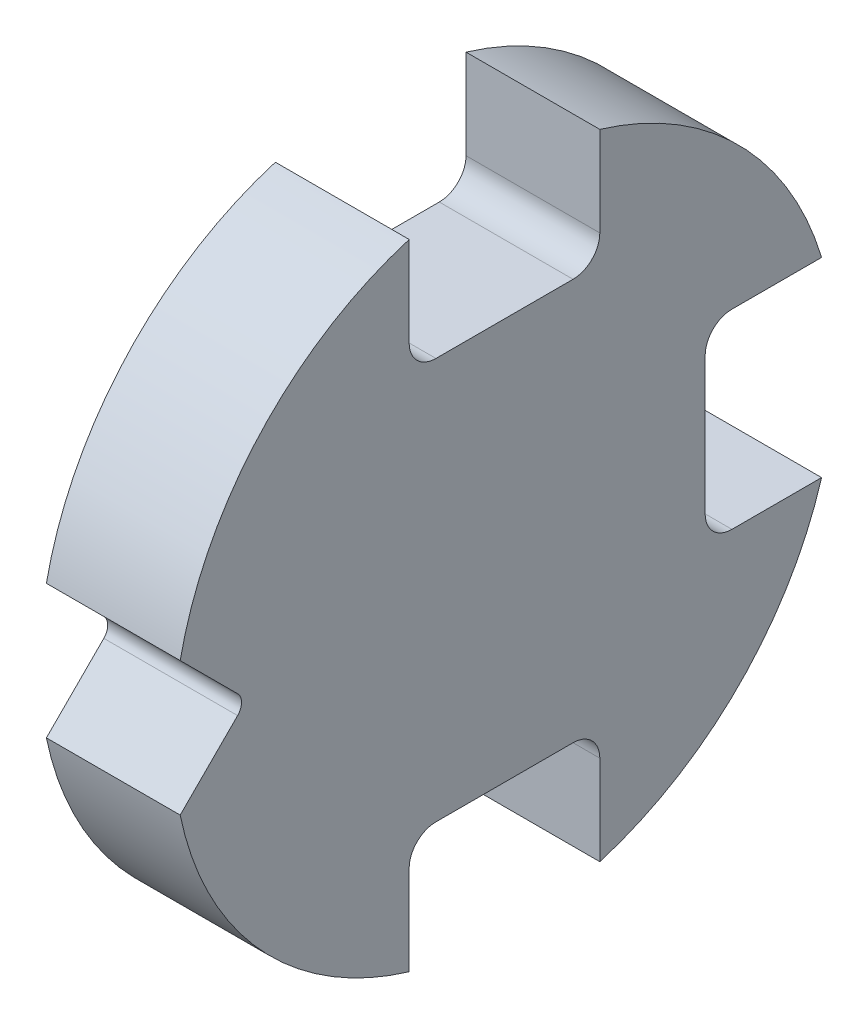
ISO-10303-21;
HEADER;
FILE_DESCRIPTION(('STEP AP214'),'2;1');
FILE_NAME('part.step','',(''),(''),'','','');
FILE_SCHEMA(('AUTOMOTIVE_DESIGN { 1 0 10303 214 1 1 1 1 }'));
ENDSEC;
DATA;
#1=APPLICATION_CONTEXT('core data for automotive mechanical design processes');
#2=APPLICATION_PROTOCOL_DEFINITION('international standard','automotive_design',2000,#1);
#3=PRODUCT_CONTEXT('',#1,'mechanical');
#4=PRODUCT('Part','Part','',(#3));
#5=PRODUCT_RELATED_PRODUCT_CATEGORY('part','',(#4));
#6=PRODUCT_DEFINITION_FORMATION('','',#4);
#7=PRODUCT_DEFINITION_CONTEXT('part definition',#1,'design');
#8=PRODUCT_DEFINITION('design','',#6,#7);
#9=PRODUCT_DEFINITION_SHAPE('','',#8);
#10=(LENGTH_UNIT() NAMED_UNIT(*) SI_UNIT(.MILLI.,.METRE.));
#11=(NAMED_UNIT(*) PLANE_ANGLE_UNIT() SI_UNIT($,.RADIAN.));
#12=(NAMED_UNIT(*) SI_UNIT($,.STERADIAN.) SOLID_ANGLE_UNIT());
#13=UNCERTAINTY_MEASURE_WITH_UNIT(LENGTH_MEASURE(1.E-05),#10,'distance_accuracy_value','');
#14=(GEOMETRIC_REPRESENTATION_CONTEXT(3) GLOBAL_UNCERTAINTY_ASSIGNED_CONTEXT((#13)) GLOBAL_UNIT_ASSIGNED_CONTEXT((#10,
#11,#12)) REPRESENTATION_CONTEXT('',''));
#15=CARTESIAN_POINT('',(0.,0.,0.));
#16=DIRECTION('',(0.,0.,1.));
#17=DIRECTION('',(1.,0.,0.));
#18=AXIS2_PLACEMENT_3D('',#15,#16,#17);
#19=CARTESIAN_POINT('',(44.13,0.,4.13078041851604));
#20=DIRECTION('',(1.,0.,0.));
#21=DIRECTION('',(0.,0.,-1.));
#22=AXIS2_PLACEMENT_3D('',#19,#20,#21);
#23=CYLINDRICAL_SURFACE('',#22,0.2);
#24=DIRECTION('',(1.,0.,0.));
#25=VECTOR('',#24,1.);
#26=CARTESIAN_POINT('',(45.13,0.14142135623743,3.98935906213743));
#27=LINE('',#26,#25);
#28=CARTESIAN_POINT('',(44.13,0.141421356231545,3.98935906220226));
#29=VERTEX_POINT('',#28);
#30=CARTESIAN_POINT('',(46.13,0.141421356272725,3.98935906217272));
#31=VERTEX_POINT('',#30);
#32=EDGE_CURVE('E176',#29,#31,#27,.T.);
#33=ORIENTED_EDGE('',*,*,#32,.F.);
#34=CARTESIAN_POINT('',(44.13,0.,4.13078041851604));
#35=DIRECTION('',(1.,0.,0.));
#36=DIRECTION('',(0.,0.,-1.));
#37=AXIS2_PLACEMENT_3D('',#34,#35,#36);
#38=CIRCLE('',#37,0.2);
#39=CARTESIAN_POINT('',(44.13,-0.141421356272665,3.98935906217266));
#40=VERTEX_POINT('',#39);
#41=EDGE_CURVE('E20',#40,#29,#38,.T.);
#42=ORIENTED_EDGE('',*,*,#41,.F.);
#43=DIRECTION('',(1.,0.,0.));
#44=VECTOR('',#43,1.);
#45=CARTESIAN_POINT('',(45.13,-0.141421356237311,3.98935906213731));
#46=LINE('',#45,#44);
#47=CARTESIAN_POINT('',(46.13,-0.141421356272666,3.98935906217266));
#48=VERTEX_POINT('',#47);
#49=EDGE_CURVE('E226',#48,#40,#46,.F.);
#50=ORIENTED_EDGE('',*,*,#49,.F.);
#51=CARTESIAN_POINT('',(46.13,0.,4.13078041851604));
#52=DIRECTION('',(1.,0.,0.));
#53=DIRECTION('',(0.,0.,-1.));
#54=AXIS2_PLACEMENT_3D('',#51,#52,#53);
#55=CIRCLE('',#54,0.2);
#56=EDGE_CURVE('E175',#31,#48,#55,.F.);
#57=ORIENTED_EDGE('',*,*,#56,.F.);
#58=EDGE_LOOP('',(#33,#42,#50,#57));
#59=FACE_BOUND('',#58,.T.);
#60=ADVANCED_FACE('F17',(#59),#23,.F.);
#61=CARTESIAN_POINT('',(45.13,-0.500000000009512,4.34793770590951));
#62=DIRECTION('',(0.,0.707106781186548,0.707106781186547));
#63=DIRECTION('',(0.,-0.707106781186547,0.707106781186548));
#64=AXIS2_PLACEMENT_3D('',#61,#62,#63);
#65=PLANE('',#64);
#66=DIRECTION('',(1.,0.,0.));
#67=VECTOR('',#66,1.);
#68=CARTESIAN_POINT('',(45.13,-1.00000000000862,4.84793770586863));
#69=LINE('',#68,#67);
#70=CARTESIAN_POINT('',(46.13,-0.999999999992045,4.84793770587205));
#71=VERTEX_POINT('',#70);
#72=CARTESIAN_POINT('',(44.13,-0.999999999992044,4.84793770587205));
#73=VERTEX_POINT('',#72);
#74=EDGE_CURVE('E273',#71,#73,#69,.F.);
#75=ORIENTED_EDGE('',*,*,#74,.F.);
#76=DIRECTION('',(0.,-0.707106781186547,0.707106781186548));
#77=VECTOR('',#76,1.);
#78=CARTESIAN_POINT('',(46.13,-0.500000000009512,4.34793770590951));
#79=LINE('',#78,#77);
#80=EDGE_CURVE('E223',#71,#48,#79,.F.);
#81=ORIENTED_EDGE('',*,*,#80,.T.);
#82=ORIENTED_EDGE('',*,*,#49,.T.);
#83=DIRECTION('',(0.,0.707106781186547,-0.707106781186548));
#84=VECTOR('',#83,1.);
#85=CARTESIAN_POINT('',(44.13,-1.00000000001902,4.84793770591902));
#86=LINE('',#85,#84);
#87=EDGE_CURVE('E174',#73,#40,#86,.T.);
#88=ORIENTED_EDGE('',*,*,#87,.F.);
#89=EDGE_LOOP('',(#75,#81,#82,#88));
#90=FACE_BOUND('',#89,.T.);
#91=ADVANCED_FACE('F305',(#90),#65,.T.);
#92=CARTESIAN_POINT('',(44.13,-8.4,1.425));
#93=DIRECTION('',(0.,0.,1.));
#94=DIRECTION('',(1.,0.,0.));
#95=AXIS2_PLACEMENT_3D('',#92,#93,#94);
#96=PLANE('',#95);
#97=DIRECTION('',(0.,1.,0.));
#98=VECTOR('',#97,1.);
#99=CARTESIAN_POINT('',(44.13,0.,1.425));
#100=LINE('',#99,#98);
#101=CARTESIAN_POINT('',(44.13,-3.40000000005,1.42499999995));
#102=VERTEX_POINT('',#101);
#103=CARTESIAN_POINT('',(44.13,-4.74045092791815,1.425));
#104=VERTEX_POINT('',#103);
#105=EDGE_CURVE('E277',#102,#104,#100,.F.);
#106=ORIENTED_EDGE('',*,*,#105,.F.);
#107=DIRECTION('',(1.,0.,0.));
#108=VECTOR('',#107,1.);
#109=CARTESIAN_POINT('',(44.13,-3.4,1.4249999999));
#110=LINE('',#109,#108);
#111=CARTESIAN_POINT('',(46.13,-3.40000000005,1.42499999995));
#112=VERTEX_POINT('',#111);
#113=EDGE_CURVE('E227',#102,#112,#110,.T.);
#114=ORIENTED_EDGE('',*,*,#113,.T.);
#115=DIRECTION('',(0.,1.,0.));
#116=VECTOR('',#115,1.);
#117=CARTESIAN_POINT('',(46.13,-8.4,1.425));
#118=LINE('',#117,#116);
#119=CARTESIAN_POINT('',(46.13,-4.74045092791815,1.425));
#120=VERTEX_POINT('',#119);
#121=EDGE_CURVE('E220',#120,#112,#118,.T.);
#122=ORIENTED_EDGE('',*,*,#121,.F.);
#123=DIRECTION('',(1.,0.,0.));
#124=VECTOR('',#123,1.);
#125=CARTESIAN_POINT('',(45.13,-4.74045092791815,1.425));
#126=LINE('',#125,#124);
#127=EDGE_CURVE('E272',#104,#120,#126,.T.);
#128=ORIENTED_EDGE('',*,*,#127,.F.);
#129=EDGE_LOOP('',(#106,#114,#122,#128));
#130=FACE_BOUND('',#129,.T.);
#131=ADVANCED_FACE('F318',(#130),#96,.F.);
#132=CARTESIAN_POINT('',(44.13,-3.4000000001,-1.0249999999));
#133=DIRECTION('',(1.,0.,0.));
#134=DIRECTION('',(0.,0.,-1.));
#135=AXIS2_PLACEMENT_3D('',#132,#133,#134);
#136=CYLINDRICAL_SURFACE('',#135,0.4);
#137=DIRECTION('',(1.,0.,0.));
#138=VECTOR('',#137,1.);
#139=CARTESIAN_POINT('',(44.13,-3.,-1.025));
#140=LINE('',#139,#138);
#141=CARTESIAN_POINT('',(46.13,-3.00000000005,-1.02499999995));
#142=VERTEX_POINT('',#141);
#143=CARTESIAN_POINT('',(44.13,-3.,-1.02499999995));
#144=VERTEX_POINT('',#143);
#145=EDGE_CURVE('E219',#142,#144,#140,.F.);
#146=ORIENTED_EDGE('',*,*,#145,.T.);
#147=CARTESIAN_POINT('',(44.13,-3.4000000001,-1.0249999999));
#148=DIRECTION('',(1.,0.,0.));
#149=DIRECTION('',(0.,0.,-1.));
#150=AXIS2_PLACEMENT_3D('',#147,#148,#149);
#151=CIRCLE('',#150,0.4);
#152=CARTESIAN_POINT('',(44.13,-3.40000000005009,-1.425));
#153=VERTEX_POINT('',#152);
#154=EDGE_CURVE('E278',#153,#144,#151,.T.);
#155=ORIENTED_EDGE('',*,*,#154,.F.);
#156=DIRECTION('',(-1.,0.,0.));
#157=VECTOR('',#156,1.);
#158=CARTESIAN_POINT('',(44.13,-3.40000000000017,-1.425));
#159=LINE('',#158,#157);
#160=CARTESIAN_POINT('',(46.13,-3.40000000005009,-1.425));
#161=VERTEX_POINT('',#160);
#162=EDGE_CURVE('E214',#153,#161,#159,.F.);
#163=ORIENTED_EDGE('',*,*,#162,.T.);
#164=CARTESIAN_POINT('',(46.13,-3.4000000001,-1.0249999999));
#165=DIRECTION('',(1.,0.,0.));
#166=DIRECTION('',(0.,0.,-1.));
#167=AXIS2_PLACEMENT_3D('',#164,#165,#166);
#168=CIRCLE('',#167,0.4);
#169=EDGE_CURVE('E222',#142,#161,#168,.F.);
#170=ORIENTED_EDGE('',*,*,#169,.F.);
#171=EDGE_LOOP('',(#146,#155,#163,#170));
#172=FACE_BOUND('',#171,.T.);
#173=ADVANCED_FACE('F394',(#172),#136,.F.);
#174=CARTESIAN_POINT('',(44.13,-3.4000000001,1.0249999999));
#175=DIRECTION('',(1.,0.,0.));
#176=DIRECTION('',(0.,0.,-1.));
#177=AXIS2_PLACEMENT_3D('',#174,#175,#176);
#178=CYLINDRICAL_SURFACE('',#177,0.4);
#179=ORIENTED_EDGE('',*,*,#113,.F.);
#180=CARTESIAN_POINT('',(44.13,-3.4000000001,1.0249999999));
#181=DIRECTION('',(1.,0.,0.));
#182=DIRECTION('',(0.,0.,-1.));
#183=AXIS2_PLACEMENT_3D('',#180,#181,#182);
#184=CIRCLE('',#183,0.4);
#185=CARTESIAN_POINT('',(44.13,-3.,1.02499999994991));
#186=VERTEX_POINT('',#185);
#187=EDGE_CURVE('E274',#186,#102,#184,.T.);
#188=ORIENTED_EDGE('',*,*,#187,.F.);
#189=DIRECTION('',(1.,0.,0.));
#190=VECTOR('',#189,1.);
#191=CARTESIAN_POINT('',(44.13,-3.,1.02499999999983));
#192=LINE('',#191,#190);
#193=CARTESIAN_POINT('',(46.13,-3.00000000005,1.02499999994991));
#194=VERTEX_POINT('',#193);
#195=EDGE_CURVE('E218',#186,#194,#192,.T.);
#196=ORIENTED_EDGE('',*,*,#195,.T.);
#197=CARTESIAN_POINT('',(46.13,-3.4000000001,1.0249999999));
#198=DIRECTION('',(1.,0.,0.));
#199=DIRECTION('',(0.,0.,-1.));
#200=AXIS2_PLACEMENT_3D('',#197,#198,#199);
#201=CIRCLE('',#200,0.4);
#202=EDGE_CURVE('E230',#112,#194,#201,.F.);
#203=ORIENTED_EDGE('',*,*,#202,.F.);
#204=EDGE_LOOP('',(#179,#188,#196,#203));
#205=FACE_BOUND('',#204,.T.);
#206=ADVANCED_FACE('F320',(#205),#178,.F.);
#207=CARTESIAN_POINT('',(44.13,-8.40000000000008,-1.425));
#208=DIRECTION('',(0.,0.,-1.));
#209=DIRECTION('',(-1.,0.,0.));
#210=AXIS2_PLACEMENT_3D('',#207,#208,#209);
#211=PLANE('',#210);
#212=DIRECTION('',(0.,1.,0.));
#213=VECTOR('',#212,1.);
#214=CARTESIAN_POINT('',(46.13,-8.40000000000008,-1.425));
#215=LINE('',#214,#213);
#216=CARTESIAN_POINT('',(46.13,-4.74045092791815,-1.425));
#217=VERTEX_POINT('',#216);
#218=EDGE_CURVE('E212',#161,#217,#215,.F.);
#219=ORIENTED_EDGE('',*,*,#218,.F.);
#220=ORIENTED_EDGE('',*,*,#162,.F.);
#221=DIRECTION('',(0.,1.,0.));
#222=VECTOR('',#221,1.);
#223=CARTESIAN_POINT('',(44.13,0.,-1.425));
#224=LINE('',#223,#222);
#225=CARTESIAN_POINT('',(44.13,-4.74045092791815,-1.425));
#226=VERTEX_POINT('',#225);
#227=EDGE_CURVE('E281',#226,#153,#224,.T.);
#228=ORIENTED_EDGE('',*,*,#227,.F.);
#229=DIRECTION('',(1.,0.,0.));
#230=VECTOR('',#229,1.);
#231=CARTESIAN_POINT('',(45.13,-4.74045092791815,-1.425));
#232=LINE('',#231,#230);
#233=EDGE_CURVE('E268',#217,#226,#232,.F.);
#234=ORIENTED_EDGE('',*,*,#233,.F.);
#235=EDGE_LOOP('',(#219,#220,#228,#234));
#236=FACE_BOUND('',#235,.T.);
#237=ADVANCED_FACE('F391',(#236),#211,.F.);
#238=CARTESIAN_POINT('',(44.13,-1.425,-8.4));
#239=DIRECTION('',(0.,-1.,0.));
#240=DIRECTION('',(0.,0.,-1.));
#241=AXIS2_PLACEMENT_3D('',#238,#239,#240);
#242=PLANE('',#241);
#243=DIRECTION('',(0.,0.,1.));
#244=VECTOR('',#243,1.);
#245=CARTESIAN_POINT('',(44.13,-1.425,2.475));
#246=LINE('',#245,#244);
#247=CARTESIAN_POINT('',(44.13,-1.42499999995,-3.40000000005));
#248=VERTEX_POINT('',#247);
#249=CARTESIAN_POINT('',(44.13,-1.425,-4.74045092791815));
#250=VERTEX_POINT('',#249);
#251=EDGE_CURVE('E285',#248,#250,#246,.F.);
#252=ORIENTED_EDGE('',*,*,#251,.F.);
#253=DIRECTION('',(1.,0.,0.));
#254=VECTOR('',#253,1.);
#255=CARTESIAN_POINT('',(44.13,-1.4249999999,-3.4));
#256=LINE('',#255,#254);
#257=CARTESIAN_POINT('',(46.13,-1.42499999995,-3.40000000005));
#258=VERTEX_POINT('',#257);
#259=EDGE_CURVE('E233',#248,#258,#256,.T.);
#260=ORIENTED_EDGE('',*,*,#259,.T.);
#261=DIRECTION('',(0.,0.,-1.));
#262=VECTOR('',#261,1.);
#263=CARTESIAN_POINT('',(46.13,-1.425,-8.4));
#264=LINE('',#263,#262);
#265=CARTESIAN_POINT('',(46.13,-1.425,-4.74045092791815));
#266=VERTEX_POINT('',#265);
#267=EDGE_CURVE('E209',#266,#258,#264,.F.);
#268=ORIENTED_EDGE('',*,*,#267,.F.);
#269=DIRECTION('',(1.,0.,0.));
#270=VECTOR('',#269,1.);
#271=CARTESIAN_POINT('',(45.13,-1.425,-4.74045092791815));
#272=LINE('',#271,#270);
#273=EDGE_CURVE('E267',#250,#266,#272,.T.);
#274=ORIENTED_EDGE('',*,*,#273,.F.);
#275=EDGE_LOOP('',(#252,#260,#268,#274));
#276=FACE_BOUND('',#275,.T.);
#277=ADVANCED_FACE('F384',(#276),#242,.F.);
#278=CARTESIAN_POINT('',(44.13,1.0249999999,-3.4000000001));
#279=DIRECTION('',(1.,0.,0.));
#280=DIRECTION('',(0.,0.,-1.));
#281=AXIS2_PLACEMENT_3D('',#278,#279,#280);
#282=CYLINDRICAL_SURFACE('',#281,0.4);
#283=DIRECTION('',(1.,0.,0.));
#284=VECTOR('',#283,1.);
#285=CARTESIAN_POINT('',(44.13,1.025,-3.));
#286=LINE('',#285,#284);
#287=CARTESIAN_POINT('',(46.13,1.02499999995,-3.00000000005));
#288=VERTEX_POINT('',#287);
#289=CARTESIAN_POINT('',(44.13,1.02499999995,-3.));
#290=VERTEX_POINT('',#289);
#291=EDGE_CURVE('E208',#288,#290,#286,.F.);
#292=ORIENTED_EDGE('',*,*,#291,.T.);
#293=CARTESIAN_POINT('',(44.13,1.0249999999,-3.4000000001));
#294=DIRECTION('',(1.,0.,0.));
#295=DIRECTION('',(0.,0.,-1.));
#296=AXIS2_PLACEMENT_3D('',#293,#294,#295);
#297=CIRCLE('',#296,0.4);
#298=CARTESIAN_POINT('',(44.13,1.425,-3.40000000005009));
#299=VERTEX_POINT('',#298);
#300=EDGE_CURVE('E286',#299,#290,#297,.T.);
#301=ORIENTED_EDGE('',*,*,#300,.F.);
#302=DIRECTION('',(1.,0.,0.));
#303=VECTOR('',#302,1.);
#304=CARTESIAN_POINT('',(44.13,1.425,-3.40000000000017));
#305=LINE('',#304,#303);
#306=CARTESIAN_POINT('',(46.13,1.425,-3.40000000005009));
#307=VERTEX_POINT('',#306);
#308=EDGE_CURVE('E203',#299,#307,#305,.T.);
#309=ORIENTED_EDGE('',*,*,#308,.T.);
#310=CARTESIAN_POINT('',(46.13,1.0249999999,-3.4000000001));
#311=DIRECTION('',(1.,0.,0.));
#312=DIRECTION('',(0.,0.,-1.));
#313=AXIS2_PLACEMENT_3D('',#310,#311,#312);
#314=CIRCLE('',#313,0.4);
#315=EDGE_CURVE('E211',#288,#307,#314,.F.);
#316=ORIENTED_EDGE('',*,*,#315,.F.);
#317=EDGE_LOOP('',(#292,#301,#309,#316));
#318=FACE_BOUND('',#317,.T.);
#319=ADVANCED_FACE('F395',(#318),#282,.F.);
#320=CARTESIAN_POINT('',(44.13,-1.0249999999,-3.4000000001));
#321=DIRECTION('',(1.,0.,0.));
#322=DIRECTION('',(0.,0.,-1.));
#323=AXIS2_PLACEMENT_3D('',#320,#321,#322);
#324=CYLINDRICAL_SURFACE('',#323,0.4);
#325=ORIENTED_EDGE('',*,*,#259,.F.);
#326=CARTESIAN_POINT('',(44.13,-1.0249999999,-3.4000000001));
#327=DIRECTION('',(1.,0.,0.));
#328=DIRECTION('',(0.,0.,-1.));
#329=AXIS2_PLACEMENT_3D('',#326,#327,#328);
#330=CIRCLE('',#329,0.4);
#331=CARTESIAN_POINT('',(44.13,-1.02499999994991,-3.));
#332=VERTEX_POINT('',#331);
#333=EDGE_CURVE('E282',#332,#248,#330,.T.);
#334=ORIENTED_EDGE('',*,*,#333,.F.);
#335=DIRECTION('',(1.,0.,0.));
#336=VECTOR('',#335,1.);
#337=CARTESIAN_POINT('',(44.13,-1.02499999999983,-3.));
#338=LINE('',#337,#336);
#339=CARTESIAN_POINT('',(46.13,-1.02499999994991,-3.00000000005));
#340=VERTEX_POINT('',#339);
#341=EDGE_CURVE('E207',#332,#340,#338,.T.);
#342=ORIENTED_EDGE('',*,*,#341,.T.);
#343=CARTESIAN_POINT('',(46.13,-1.0249999999,-3.4000000001));
#344=DIRECTION('',(1.,0.,0.));
#345=DIRECTION('',(0.,0.,-1.));
#346=AXIS2_PLACEMENT_3D('',#343,#344,#345);
#347=CIRCLE('',#346,0.4);
#348=EDGE_CURVE('E236',#258,#340,#347,.F.);
#349=ORIENTED_EDGE('',*,*,#348,.F.);
#350=EDGE_LOOP('',(#325,#334,#342,#349));
#351=FACE_BOUND('',#350,.T.);
#352=ADVANCED_FACE('F379',(#351),#324,.F.);
#353=CARTESIAN_POINT('',(44.13,1.425,-8.40000000000008));
#354=DIRECTION('',(0.,1.,0.));
#355=DIRECTION('',(0.,0.,1.));
#356=AXIS2_PLACEMENT_3D('',#353,#354,#355);
#357=PLANE('',#356);
#358=DIRECTION('',(0.,0.,1.));
#359=VECTOR('',#358,1.);
#360=CARTESIAN_POINT('',(46.13,1.425,-8.40000000000008));
#361=LINE('',#360,#359);
#362=CARTESIAN_POINT('',(46.13,1.425,-4.74045092791815));
#363=VERTEX_POINT('',#362);
#364=EDGE_CURVE('E201',#307,#363,#361,.F.);
#365=ORIENTED_EDGE('',*,*,#364,.F.);
#366=ORIENTED_EDGE('',*,*,#308,.F.);
#367=DIRECTION('',(0.,0.,1.));
#368=VECTOR('',#367,1.);
#369=CARTESIAN_POINT('',(44.13,1.425,2.475));
#370=LINE('',#369,#368);
#371=CARTESIAN_POINT('',(44.13,1.425,-4.74045092791815));
#372=VERTEX_POINT('',#371);
#373=EDGE_CURVE('E289',#372,#299,#370,.T.);
#374=ORIENTED_EDGE('',*,*,#373,.F.);
#375=DIRECTION('',(1.,0.,0.));
#376=VECTOR('',#375,1.);
#377=CARTESIAN_POINT('',(45.13,1.425,-4.74045092791815));
#378=LINE('',#377,#376);
#379=EDGE_CURVE('E263',#363,#372,#378,.F.);
#380=ORIENTED_EDGE('',*,*,#379,.F.);
#381=EDGE_LOOP('',(#365,#366,#374,#380));
#382=FACE_BOUND('',#381,.T.);
#383=ADVANCED_FACE('F367',(#382),#357,.F.);
#384=CARTESIAN_POINT('',(44.13,8.4,-1.425));
#385=DIRECTION('',(0.,0.,-1.));
#386=DIRECTION('',(-1.,0.,0.));
#387=AXIS2_PLACEMENT_3D('',#384,#385,#386);
#388=PLANE('',#387);
#389=DIRECTION('',(0.,1.,0.));
#390=VECTOR('',#389,1.);
#391=CARTESIAN_POINT('',(44.13,0.,-1.425));
#392=LINE('',#391,#390);
#393=CARTESIAN_POINT('',(44.13,3.4000000001,-1.42499999995));
#394=VERTEX_POINT('',#393);
#395=CARTESIAN_POINT('',(44.13,4.74045092791815,-1.425));
#396=VERTEX_POINT('',#395);
#397=EDGE_CURVE('E293',#394,#396,#392,.T.);
#398=ORIENTED_EDGE('',*,*,#397,.F.);
#399=DIRECTION('',(1.,0.,0.));
#400=VECTOR('',#399,1.);
#401=CARTESIAN_POINT('',(44.13,3.4000000001,-1.4249999999));
#402=LINE('',#401,#400);
#403=CARTESIAN_POINT('',(46.13,3.4000000001,-1.42499999995));
#404=VERTEX_POINT('',#403);
#405=EDGE_CURVE('E239',#394,#404,#402,.T.);
#406=ORIENTED_EDGE('',*,*,#405,.T.);
#407=DIRECTION('',(0.,1.,0.));
#408=VECTOR('',#407,1.);
#409=CARTESIAN_POINT('',(46.13,8.4,-1.425));
#410=LINE('',#409,#408);
#411=CARTESIAN_POINT('',(46.13,4.74045092791815,-1.425));
#412=VERTEX_POINT('',#411);
#413=EDGE_CURVE('E198',#412,#404,#410,.F.);
#414=ORIENTED_EDGE('',*,*,#413,.F.);
#415=DIRECTION('',(1.,0.,0.));
#416=VECTOR('',#415,1.);
#417=CARTESIAN_POINT('',(45.13,4.74045092791815,-1.425));
#418=LINE('',#417,#416);
#419=EDGE_CURVE('E262',#396,#412,#418,.T.);
#420=ORIENTED_EDGE('',*,*,#419,.F.);
#421=EDGE_LOOP('',(#398,#406,#414,#420));
#422=FACE_BOUND('',#421,.T.);
#423=ADVANCED_FACE('F360',(#422),#388,.F.);
#424=CARTESIAN_POINT('',(44.13,3.4000000001,1.0249999999));
#425=DIRECTION('',(1.,0.,0.));
#426=DIRECTION('',(0.,0.,-1.));
#427=AXIS2_PLACEMENT_3D('',#424,#425,#426);
#428=CYLINDRICAL_SURFACE('',#427,0.4);
#429=DIRECTION('',(1.,0.,0.));
#430=VECTOR('',#429,1.);
#431=CARTESIAN_POINT('',(44.13,3.,1.025));
#432=LINE('',#431,#430);
#433=CARTESIAN_POINT('',(46.13,3.00000000005,1.02499999995));
#434=VERTEX_POINT('',#433);
#435=CARTESIAN_POINT('',(44.13,3.,1.02499999995));
#436=VERTEX_POINT('',#435);
#437=EDGE_CURVE('E197',#434,#436,#432,.F.);
#438=ORIENTED_EDGE('',*,*,#437,.T.);
#439=CARTESIAN_POINT('',(44.13,3.4000000001,1.0249999999));
#440=DIRECTION('',(1.,0.,0.));
#441=DIRECTION('',(0.,0.,-1.));
#442=AXIS2_PLACEMENT_3D('',#439,#440,#441);
#443=CIRCLE('',#442,0.4);
#444=CARTESIAN_POINT('',(44.13,3.40000000005009,1.425));
#445=VERTEX_POINT('',#444);
#446=EDGE_CURVE('E184',#445,#436,#443,.T.);
#447=ORIENTED_EDGE('',*,*,#446,.F.);
#448=DIRECTION('',(1.,0.,0.));
#449=VECTOR('',#448,1.);
#450=CARTESIAN_POINT('',(44.13,3.40000000000017,1.425));
#451=LINE('',#450,#449);
#452=CARTESIAN_POINT('',(46.13,3.40000000005009,1.425));
#453=VERTEX_POINT('',#452);
#454=EDGE_CURVE('E191',#445,#453,#451,.T.);
#455=ORIENTED_EDGE('',*,*,#454,.T.);
#456=CARTESIAN_POINT('',(46.13,3.4000000001,1.0249999999));
#457=DIRECTION('',(1.,0.,0.));
#458=DIRECTION('',(0.,0.,-1.));
#459=AXIS2_PLACEMENT_3D('',#456,#457,#458);
#460=CIRCLE('',#459,0.4);
#461=EDGE_CURVE('E200',#434,#453,#460,.F.);
#462=ORIENTED_EDGE('',*,*,#461,.F.);
#463=EDGE_LOOP('',(#438,#447,#455,#462));
#464=FACE_BOUND('',#463,.T.);
#465=ADVANCED_FACE('F439',(#464),#428,.F.);
#466=CARTESIAN_POINT('',(44.13,3.4000000001,-1.0249999999));
#467=DIRECTION('',(1.,0.,0.));
#468=DIRECTION('',(0.,0.,-1.));
#469=AXIS2_PLACEMENT_3D('',#466,#467,#468);
#470=CYLINDRICAL_SURFACE('',#469,0.4);
#471=ORIENTED_EDGE('',*,*,#405,.F.);
#472=CARTESIAN_POINT('',(44.13,3.4000000001,-1.0249999999));
#473=DIRECTION('',(1.,0.,0.));
#474=DIRECTION('',(0.,0.,-1.));
#475=AXIS2_PLACEMENT_3D('',#472,#473,#474);
#476=CIRCLE('',#475,0.4);
#477=CARTESIAN_POINT('',(44.13,3.,-1.02499999994991));
#478=VERTEX_POINT('',#477);
#479=EDGE_CURVE('E290',#478,#394,#476,.T.);
#480=ORIENTED_EDGE('',*,*,#479,.F.);
#481=DIRECTION('',(1.,0.,0.));
#482=VECTOR('',#481,1.);
#483=CARTESIAN_POINT('',(44.13,3.,-1.02499999999983));
#484=LINE('',#483,#482);
#485=CARTESIAN_POINT('',(46.13,3.00000000005,-1.02499999994991));
#486=VERTEX_POINT('',#485);
#487=EDGE_CURVE('E196',#478,#486,#484,.T.);
#488=ORIENTED_EDGE('',*,*,#487,.T.);
#489=CARTESIAN_POINT('',(46.13,3.4000000001,-1.0249999999));
#490=DIRECTION('',(1.,0.,0.));
#491=DIRECTION('',(0.,0.,-1.));
#492=AXIS2_PLACEMENT_3D('',#489,#490,#491);
#493=CIRCLE('',#492,0.4);
#494=EDGE_CURVE('E177',#404,#486,#493,.F.);
#495=ORIENTED_EDGE('',*,*,#494,.F.);
#496=EDGE_LOOP('',(#471,#480,#488,#495));
#497=FACE_BOUND('',#496,.T.);
#498=ADVANCED_FACE('F436',(#497),#470,.F.);
#499=CARTESIAN_POINT('',(45.13,0.500000000009513,4.34793770590951));
#500=DIRECTION('',(0.,-0.707106781186547,0.707106781186548));
#501=DIRECTION('',(0.,-0.707106781186548,-0.707106781186547));
#502=AXIS2_PLACEMENT_3D('',#499,#500,#501);
#503=PLANE('',#502);
#504=DIRECTION('',(1.,0.,0.));
#505=VECTOR('',#504,1.);
#506=CARTESIAN_POINT('',(45.13,1.00000000000864,4.84793770586862));
#507=LINE('',#506,#505);
#508=CARTESIAN_POINT('',(44.13,0.999999999992055,4.84793770587204));
#509=VERTEX_POINT('',#508);
#510=CARTESIAN_POINT('',(46.13,0.999999999992052,4.84793770587205));
#511=VERTEX_POINT('',#510);
#512=EDGE_CURVE('E180',#509,#511,#507,.T.);
#513=ORIENTED_EDGE('',*,*,#512,.F.);
#514=DIRECTION('',(0.,0.707106781244788,0.707106781128307));
#515=VECTOR('',#514,1.);
#516=CARTESIAN_POINT('',(44.13,0.141421356166717,3.98935906220814));
#517=LINE('',#516,#515);
#518=EDGE_CURVE('E171',#29,#509,#517,.T.);
#519=ORIENTED_EDGE('',*,*,#518,.F.);
#520=ORIENTED_EDGE('',*,*,#32,.T.);
#521=DIRECTION('',(0.,-0.707106781186548,-0.707106781186547));
#522=VECTOR('',#521,1.);
#523=CARTESIAN_POINT('',(46.13,0.500000000009513,4.34793770590951));
#524=LINE('',#523,#522);
#525=EDGE_CURVE('E35',#31,#511,#524,.F.);
#526=ORIENTED_EDGE('',*,*,#525,.T.);
#527=EDGE_LOOP('',(#513,#519,#520,#526));
#528=FACE_BOUND('',#527,.T.);
#529=ADVANCED_FACE('F179',(#528),#503,.T.);
#530=CARTESIAN_POINT('',(44.13,8.40000000000008,1.425));
#531=DIRECTION('',(0.,0.,1.));
#532=DIRECTION('',(1.,0.,0.));
#533=AXIS2_PLACEMENT_3D('',#530,#531,#532);
#534=PLANE('',#533);
#535=DIRECTION('',(0.,1.,0.));
#536=VECTOR('',#535,1.);
#537=CARTESIAN_POINT('',(46.13,8.40000000000008,1.425));
#538=LINE('',#537,#536);
#539=CARTESIAN_POINT('',(46.13,4.74045092791815,1.425));
#540=VERTEX_POINT('',#539);
#541=EDGE_CURVE('E186',#453,#540,#538,.T.);
#542=ORIENTED_EDGE('',*,*,#541,.F.);
#543=ORIENTED_EDGE('',*,*,#454,.F.);
#544=DIRECTION('',(0.,1.,0.));
#545=VECTOR('',#544,1.);
#546=CARTESIAN_POINT('',(44.13,0.,1.425));
#547=LINE('',#546,#545);
#548=CARTESIAN_POINT('',(44.13,4.74045092791815,1.425));
#549=VERTEX_POINT('',#548);
#550=EDGE_CURVE('E181',#549,#445,#547,.F.);
#551=ORIENTED_EDGE('',*,*,#550,.F.);
#552=DIRECTION('',(1.,0.,0.));
#553=VECTOR('',#552,1.);
#554=CARTESIAN_POINT('',(45.13,4.74045092791815,1.425));
#555=LINE('',#554,#553);
#556=EDGE_CURVE('E258',#540,#549,#555,.F.);
#557=ORIENTED_EDGE('',*,*,#556,.F.);
#558=EDGE_LOOP('',(#542,#543,#551,#557));
#559=FACE_BOUND('',#558,.T.);
#560=ADVANCED_FACE('F430',(#559),#534,.F.);
#561=CARTESIAN_POINT('',(44.13,0.,2.475));
#562=DIRECTION('',(-1.,0.,0.));
#563=DIRECTION('',(0.,0.,1.));
#564=AXIS2_PLACEMENT_3D('',#561,#562,#563);
#565=PLANE('',#564);
#566=ORIENTED_EDGE('',*,*,#105,.T.);
#567=CARTESIAN_POINT('',(44.13,0.,0.));
#568=DIRECTION('',(1.,0.,0.));
#569=DIRECTION('',(0.,0.,-1.));
#570=AXIS2_PLACEMENT_3D('',#567,#568,#569);
#571=CIRCLE('',#570,4.95);
#572=EDGE_CURVE('E269',#73,#104,#571,.T.);
#573=ORIENTED_EDGE('',*,*,#572,.F.);
#574=ORIENTED_EDGE('',*,*,#87,.T.);
#575=ORIENTED_EDGE('',*,*,#41,.T.);
#576=ORIENTED_EDGE('',*,*,#518,.T.);
#577=CARTESIAN_POINT('',(44.13,0.,0.));
#578=DIRECTION('',(1.,0.,0.));
#579=DIRECTION('',(0.,0.,-1.));
#580=AXIS2_PLACEMENT_3D('',#577,#578,#579);
#581=CIRCLE('',#580,4.95);
#582=EDGE_CURVE('E256',#549,#509,#581,.T.);
#583=ORIENTED_EDGE('',*,*,#582,.F.);
#584=ORIENTED_EDGE('',*,*,#550,.T.);
#585=ORIENTED_EDGE('',*,*,#446,.T.);
#586=DIRECTION('',(0.,0.,-1.));
#587=VECTOR('',#586,1.);
#588=CARTESIAN_POINT('',(44.13,3.,0.5125));
#589=LINE('',#588,#587);
#590=EDGE_CURVE('E193',#436,#478,#589,.T.);
#591=ORIENTED_EDGE('',*,*,#590,.T.);
#592=ORIENTED_EDGE('',*,*,#479,.T.);
#593=ORIENTED_EDGE('',*,*,#397,.T.);
#594=CARTESIAN_POINT('',(44.13,0.,0.));
#595=DIRECTION('',(1.,0.,0.));
#596=DIRECTION('',(0.,0.,-1.));
#597=AXIS2_PLACEMENT_3D('',#594,#595,#596);
#598=CIRCLE('',#597,4.95);
#599=EDGE_CURVE('E259',#372,#396,#598,.T.);
#600=ORIENTED_EDGE('',*,*,#599,.F.);
#601=ORIENTED_EDGE('',*,*,#373,.T.);
#602=ORIENTED_EDGE('',*,*,#300,.T.);
#603=DIRECTION('',(0.,1.,0.));
#604=VECTOR('',#603,1.);
#605=CARTESIAN_POINT('',(44.13,0.5125,-3.));
#606=LINE('',#605,#604);
#607=EDGE_CURVE('E204',#290,#332,#606,.F.);
#608=ORIENTED_EDGE('',*,*,#607,.T.);
#609=ORIENTED_EDGE('',*,*,#333,.T.);
#610=ORIENTED_EDGE('',*,*,#251,.T.);
#611=CARTESIAN_POINT('',(44.13,0.,0.));
#612=DIRECTION('',(1.,0.,0.));
#613=DIRECTION('',(0.,0.,-1.));
#614=AXIS2_PLACEMENT_3D('',#611,#612,#613);
#615=CIRCLE('',#614,4.95);
#616=EDGE_CURVE('E264',#226,#250,#615,.T.);
#617=ORIENTED_EDGE('',*,*,#616,.F.);
#618=ORIENTED_EDGE('',*,*,#227,.T.);
#619=ORIENTED_EDGE('',*,*,#154,.T.);
#620=DIRECTION('',(0.,0.,1.));
#621=VECTOR('',#620,1.);
#622=CARTESIAN_POINT('',(44.13,-3.,-0.5125));
#623=LINE('',#622,#621);
#624=EDGE_CURVE('E215',#144,#186,#623,.T.);
#625=ORIENTED_EDGE('',*,*,#624,.T.);
#626=ORIENTED_EDGE('',*,*,#187,.T.);
#627=EDGE_LOOP('',(#566,#573,#574,#575,#576,#583,#584,#585,#591,#592,#593,#600,#601,#602,#608,
#609,#610,#617,#618,#619,#625,#626));
#628=FACE_BOUND('',#627,.T.);
#629=ADVANCED_FACE('F168',(#628),#565,.T.);
#630=CARTESIAN_POINT('',(45.13,0.,0.));
#631=DIRECTION('',(1.,0.,0.));
#632=DIRECTION('',(0.,0.,-1.));
#633=AXIS2_PLACEMENT_3D('',#630,#631,#632);
#634=CYLINDRICAL_SURFACE('',#633,4.95);
#635=ORIENTED_EDGE('',*,*,#127,.T.);
#636=CARTESIAN_POINT('',(46.13,0.,0.));
#637=DIRECTION('',(1.,0.,0.));
#638=DIRECTION('',(0.,0.,-1.));
#639=AXIS2_PLACEMENT_3D('',#636,#637,#638);
#640=CIRCLE('',#639,4.95);
#641=EDGE_CURVE('E253',#71,#120,#640,.T.);
#642=ORIENTED_EDGE('',*,*,#641,.F.);
#643=ORIENTED_EDGE('',*,*,#74,.T.);
#644=ORIENTED_EDGE('',*,*,#572,.T.);
#645=EDGE_LOOP('',(#635,#642,#643,#644));
#646=FACE_BOUND('',#645,.T.);
#647=ADVANCED_FACE('F311',(#646),#634,.T.);
#648=CARTESIAN_POINT('',(44.13,-3.,-0.5125));
#649=DIRECTION('',(0.,1.,0.));
#650=DIRECTION('',(0.,0.,1.));
#651=AXIS2_PLACEMENT_3D('',#648,#649,#650);
#652=PLANE('',#651);
#653=ORIENTED_EDGE('',*,*,#195,.F.);
#654=ORIENTED_EDGE('',*,*,#624,.F.);
#655=ORIENTED_EDGE('',*,*,#145,.F.);
#656=DIRECTION('',(0.,0.,-1.));
#657=VECTOR('',#656,1.);
#658=CARTESIAN_POINT('',(46.13,-3.0000000001,2.475));
#659=LINE('',#658,#657);
#660=EDGE_CURVE('E252',#194,#142,#659,.T.);
#661=ORIENTED_EDGE('',*,*,#660,.F.);
#662=EDGE_LOOP('',(#653,#654,#655,#661));
#663=FACE_BOUND('',#662,.T.);
#664=ADVANCED_FACE('F327',(#663),#652,.F.);
#665=CARTESIAN_POINT('',(45.13,0.,0.));
#666=DIRECTION('',(1.,0.,0.));
#667=DIRECTION('',(0.,0.,-1.));
#668=AXIS2_PLACEMENT_3D('',#665,#666,#667);
#669=CYLINDRICAL_SURFACE('',#668,4.95);
#670=ORIENTED_EDGE('',*,*,#273,.T.);
#671=CARTESIAN_POINT('',(46.13,0.,0.));
#672=DIRECTION('',(1.,0.,0.));
#673=DIRECTION('',(0.,0.,-1.));
#674=AXIS2_PLACEMENT_3D('',#671,#672,#673);
#675=CIRCLE('',#674,4.95);
#676=EDGE_CURVE('E249',#217,#266,#675,.T.);
#677=ORIENTED_EDGE('',*,*,#676,.F.);
#678=ORIENTED_EDGE('',*,*,#233,.T.);
#679=ORIENTED_EDGE('',*,*,#616,.T.);
#680=EDGE_LOOP('',(#670,#677,#678,#679));
#681=FACE_BOUND('',#680,.T.);
#682=ADVANCED_FACE('F387',(#681),#669,.T.);
#683=CARTESIAN_POINT('',(44.13,0.5125,-3.));
#684=DIRECTION('',(0.,0.,1.));
#685=DIRECTION('',(1.,0.,0.));
#686=AXIS2_PLACEMENT_3D('',#683,#684,#685);
#687=PLANE('',#686);
#688=ORIENTED_EDGE('',*,*,#341,.F.);
#689=ORIENTED_EDGE('',*,*,#607,.F.);
#690=ORIENTED_EDGE('',*,*,#291,.F.);
#691=DIRECTION('',(0.,1.,0.));
#692=VECTOR('',#691,1.);
#693=CARTESIAN_POINT('',(46.13,0.,-3.0000000001));
#694=LINE('',#693,#692);
#695=EDGE_CURVE('E248',#340,#288,#694,.T.);
#696=ORIENTED_EDGE('',*,*,#695,.F.);
#697=EDGE_LOOP('',(#688,#689,#690,#696));
#698=FACE_BOUND('',#697,.T.);
#699=ADVANCED_FACE('F374',(#698),#687,.F.);
#700=CARTESIAN_POINT('',(45.13,0.,0.));
#701=DIRECTION('',(1.,0.,0.));
#702=DIRECTION('',(0.,0.,-1.));
#703=AXIS2_PLACEMENT_3D('',#700,#701,#702);
#704=CYLINDRICAL_SURFACE('',#703,4.95);
#705=ORIENTED_EDGE('',*,*,#419,.T.);
#706=CARTESIAN_POINT('',(46.13,0.,0.));
#707=DIRECTION('',(1.,0.,0.));
#708=DIRECTION('',(0.,0.,-1.));
#709=AXIS2_PLACEMENT_3D('',#706,#707,#708);
#710=CIRCLE('',#709,4.95);
#711=EDGE_CURVE('E245',#363,#412,#710,.T.);
#712=ORIENTED_EDGE('',*,*,#711,.F.);
#713=ORIENTED_EDGE('',*,*,#379,.T.);
#714=ORIENTED_EDGE('',*,*,#599,.T.);
#715=EDGE_LOOP('',(#705,#712,#713,#714));
#716=FACE_BOUND('',#715,.T.);
#717=ADVANCED_FACE('F363',(#716),#704,.T.);
#718=CARTESIAN_POINT('',(44.13,3.,0.5125));
#719=DIRECTION('',(0.,-1.,0.));
#720=DIRECTION('',(0.,0.,-1.));
#721=AXIS2_PLACEMENT_3D('',#718,#719,#720);
#722=PLANE('',#721);
#723=ORIENTED_EDGE('',*,*,#487,.F.);
#724=ORIENTED_EDGE('',*,*,#590,.F.);
#725=ORIENTED_EDGE('',*,*,#437,.F.);
#726=DIRECTION('',(0.,0.,-1.));
#727=VECTOR('',#726,1.);
#728=CARTESIAN_POINT('',(46.13,3.0000000001,2.475));
#729=LINE('',#728,#727);
#730=EDGE_CURVE('E26',#486,#434,#729,.F.);
#731=ORIENTED_EDGE('',*,*,#730,.F.);
#732=EDGE_LOOP('',(#723,#724,#725,#731));
#733=FACE_BOUND('',#732,.T.);
#734=ADVANCED_FACE('F411',(#733),#722,.F.);
#735=CARTESIAN_POINT('',(45.13,0.,0.));
#736=DIRECTION('',(1.,0.,0.));
#737=DIRECTION('',(0.,0.,-1.));
#738=AXIS2_PLACEMENT_3D('',#735,#736,#737);
#739=CYLINDRICAL_SURFACE('',#738,4.95);
#740=ORIENTED_EDGE('',*,*,#556,.T.);
#741=ORIENTED_EDGE('',*,*,#582,.T.);
#742=ORIENTED_EDGE('',*,*,#512,.T.);
#743=CARTESIAN_POINT('',(46.13,0.,0.));
#744=DIRECTION('',(1.,0.,0.));
#745=DIRECTION('',(0.,0.,-1.));
#746=AXIS2_PLACEMENT_3D('',#743,#744,#745);
#747=CIRCLE('',#746,4.95);
#748=EDGE_CURVE('E11',#540,#511,#747,.T.);
#749=ORIENTED_EDGE('',*,*,#748,.F.);
#750=EDGE_LOOP('',(#740,#741,#742,#749));
#751=FACE_BOUND('',#750,.T.);
#752=ADVANCED_FACE('F406',(#751),#739,.T.);
#753=CARTESIAN_POINT('',(46.13,0.,2.475));
#754=DIRECTION('',(1.,0.,0.));
#755=DIRECTION('',(0.,0.,-1.));
#756=AXIS2_PLACEMENT_3D('',#753,#754,#755);
#757=PLANE('',#756);
#758=ORIENTED_EDGE('',*,*,#525,.F.);
#759=ORIENTED_EDGE('',*,*,#56,.T.);
#760=ORIENTED_EDGE('',*,*,#80,.F.);
#761=ORIENTED_EDGE('',*,*,#641,.T.);
#762=ORIENTED_EDGE('',*,*,#121,.T.);
#763=ORIENTED_EDGE('',*,*,#202,.T.);
#764=ORIENTED_EDGE('',*,*,#660,.T.);
#765=ORIENTED_EDGE('',*,*,#169,.T.);
#766=ORIENTED_EDGE('',*,*,#218,.T.);
#767=ORIENTED_EDGE('',*,*,#676,.T.);
#768=ORIENTED_EDGE('',*,*,#267,.T.);
#769=ORIENTED_EDGE('',*,*,#348,.T.);
#770=ORIENTED_EDGE('',*,*,#695,.T.);
#771=ORIENTED_EDGE('',*,*,#315,.T.);
#772=ORIENTED_EDGE('',*,*,#364,.T.);
#773=ORIENTED_EDGE('',*,*,#711,.T.);
#774=ORIENTED_EDGE('',*,*,#413,.T.);
#775=ORIENTED_EDGE('',*,*,#494,.T.);
#776=ORIENTED_EDGE('',*,*,#730,.T.);
#777=ORIENTED_EDGE('',*,*,#461,.T.);
#778=ORIENTED_EDGE('',*,*,#541,.T.);
#779=ORIENTED_EDGE('',*,*,#748,.T.);
#780=EDGE_LOOP('',(#758,#759,#760,#761,#762,#763,#764,#765,#766,#767,#768,#769,#770,#771,#772,
#773,#774,#775,#776,#777,#778,#779));
#781=FACE_BOUND('',#780,.T.);
#782=ADVANCED_FACE('F302',(#781),#757,.T.);
#783=CLOSED_SHELL('',(#60,#91,#131,#173,#206,#237,#277,#319,#352,#383,#423,#465,#498,#529,#560,
#629,#647,#664,#682,#699,#717,#734,#752,#782));
#784=MANIFOLD_SOLID_BREP('B1',#783);
#785=ADVANCED_BREP_SHAPE_REPRESENTATION('',(#18,#784),#14);
#786=SHAPE_DEFINITION_REPRESENTATION(#9,#785);
ENDSEC;
END-ISO-10303-21;
